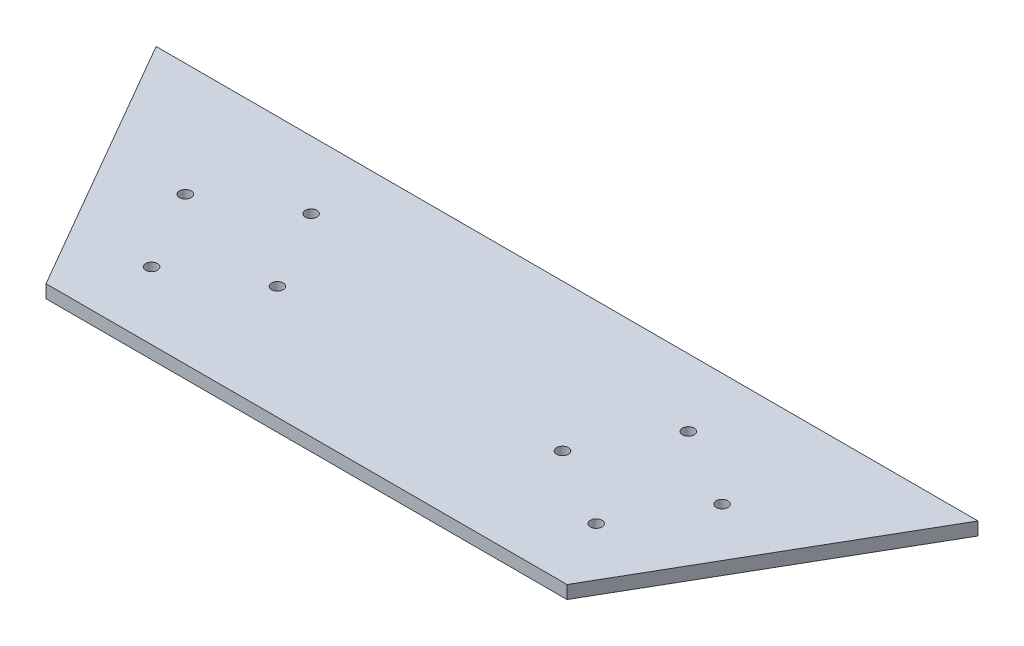
ISO-10303-21;
HEADER;
FILE_DESCRIPTION(('STEP AP214'),'2;1');
FILE_NAME('part.step','',(''),(''),'','','');
FILE_SCHEMA(('AUTOMOTIVE_DESIGN { 1 0 10303 214 1 1 1 1 }'));
ENDSEC;
DATA;
#1=APPLICATION_CONTEXT('core data for automotive mechanical design processes');
#2=APPLICATION_PROTOCOL_DEFINITION('international standard','automotive_design',2000,#1);
#3=PRODUCT_CONTEXT('',#1,'mechanical');
#4=PRODUCT('Part','Part','',(#3));
#5=PRODUCT_RELATED_PRODUCT_CATEGORY('part','',(#4));
#6=PRODUCT_DEFINITION_FORMATION('','',#4);
#7=PRODUCT_DEFINITION_CONTEXT('part definition',#1,'design');
#8=PRODUCT_DEFINITION('design','',#6,#7);
#9=PRODUCT_DEFINITION_SHAPE('','',#8);
#10=(LENGTH_UNIT() NAMED_UNIT(*) SI_UNIT(.MILLI.,.METRE.));
#11=(NAMED_UNIT(*) PLANE_ANGLE_UNIT() SI_UNIT($,.RADIAN.));
#12=(NAMED_UNIT(*) SI_UNIT($,.STERADIAN.) SOLID_ANGLE_UNIT());
#13=UNCERTAINTY_MEASURE_WITH_UNIT(LENGTH_MEASURE(1.E-05),#10,'distance_accuracy_value','');
#14=(GEOMETRIC_REPRESENTATION_CONTEXT(3) GLOBAL_UNCERTAINTY_ASSIGNED_CONTEXT((#13)) GLOBAL_UNIT_ASSIGNED_CONTEXT((#10,
#11,#12)) REPRESENTATION_CONTEXT('',''));
#15=CARTESIAN_POINT('',(0.,0.,0.));
#16=DIRECTION('',(0.,0.,1.));
#17=DIRECTION('',(1.,0.,0.));
#18=AXIS2_PLACEMENT_3D('',#15,#16,#17);
#19=CARTESIAN_POINT('',(200.,10.,0.));
#20=DIRECTION('',(-0.866025403784436,0.,-0.500000000000004));
#21=DIRECTION('',(-0.500000000000004,0.,0.866025403784436));
#22=AXIS2_PLACEMENT_3D('',#19,#20,#21);
#23=PLANE('',#22);
#24=DIRECTION('',(0.500000000000004,0.,-0.866025403784436));
#25=VECTOR('',#24,1.);
#26=CARTESIAN_POINT('',(200.,0.,0.));
#27=LINE('',#26,#25);
#28=CARTESIAN_POINT('',(200.,0.,0.));
#29=VERTEX_POINT('',#28);
#30=CARTESIAN_POINT('',(315.470053837926,0.,-200.));
#31=VERTEX_POINT('',#30);
#32=EDGE_CURVE('E96',#29,#31,#27,.T.);
#33=ORIENTED_EDGE('',*,*,#32,.T.);
#34=DIRECTION('',(0.,-1.,0.));
#35=VECTOR('',#34,1.);
#36=CARTESIAN_POINT('',(315.470053837926,10.,-200.));
#37=LINE('',#36,#35);
#38=CARTESIAN_POINT('',(315.470053837926,10.,-200.));
#39=VERTEX_POINT('',#38);
#40=EDGE_CURVE('E11',#39,#31,#37,.T.);
#41=ORIENTED_EDGE('',*,*,#40,.F.);
#42=DIRECTION('',(0.500000000000004,0.,-0.866025403784436));
#43=VECTOR('',#42,1.);
#44=CARTESIAN_POINT('',(200.,10.,0.));
#45=LINE('',#44,#43);
#46=CARTESIAN_POINT('',(200.,10.,0.));
#47=VERTEX_POINT('',#46);
#48=EDGE_CURVE('E84',#47,#39,#45,.T.);
#49=ORIENTED_EDGE('',*,*,#48,.F.);
#50=DIRECTION('',(0.,-1.,0.));
#51=VECTOR('',#50,1.);
#52=CARTESIAN_POINT('',(200.,10.,0.));
#53=LINE('',#52,#51);
#54=EDGE_CURVE('E92',#47,#29,#53,.T.);
#55=ORIENTED_EDGE('',*,*,#54,.T.);
#56=EDGE_LOOP('',(#33,#41,#49,#55));
#57=FACE_BOUND('',#56,.T.);
#58=ADVANCED_FACE('F33',(#57),#23,.F.);
#59=CARTESIAN_POINT('',(315.470053837926,10.,-200.));
#60=DIRECTION('',(0.,0.,1.));
#61=DIRECTION('',(1.,0.,0.));
#62=AXIS2_PLACEMENT_3D('',#59,#60,#61);
#63=PLANE('',#62);
#64=DIRECTION('',(-1.,0.,0.));
#65=VECTOR('',#64,1.);
#66=CARTESIAN_POINT('',(315.470053837926,0.,-200.));
#67=LINE('',#66,#65);
#68=CARTESIAN_POINT('',(-315.470053837926,0.,-200.));
#69=VERTEX_POINT('',#68);
#70=EDGE_CURVE('E88',#31,#69,#67,.T.);
#71=ORIENTED_EDGE('',*,*,#70,.T.);
#72=DIRECTION('',(0.,-1.,0.));
#73=VECTOR('',#72,1.);
#74=CARTESIAN_POINT('',(-315.470053837926,10.,-200.));
#75=LINE('',#74,#73);
#76=CARTESIAN_POINT('',(-315.470053837926,10.,-200.));
#77=VERTEX_POINT('',#76);
#78=EDGE_CURVE('E41',#77,#69,#75,.T.);
#79=ORIENTED_EDGE('',*,*,#78,.F.);
#80=DIRECTION('',(-1.,0.,0.));
#81=VECTOR('',#80,1.);
#82=CARTESIAN_POINT('',(315.470053837926,10.,-200.));
#83=LINE('',#82,#81);
#84=EDGE_CURVE('E79',#39,#77,#83,.T.);
#85=ORIENTED_EDGE('',*,*,#84,.F.);
#86=ORIENTED_EDGE('',*,*,#40,.T.);
#87=EDGE_LOOP('',(#71,#79,#85,#86));
#88=FACE_BOUND('',#87,.T.);
#89=ADVANCED_FACE('F87',(#88),#63,.F.);
#90=CARTESIAN_POINT('',(-315.470053837926,10.,-200.));
#91=DIRECTION('',(0.866025403784436,0.,-0.500000000000004));
#92=DIRECTION('',(-0.500000000000004,0.,-0.866025403784436));
#93=AXIS2_PLACEMENT_3D('',#90,#91,#92);
#94=PLANE('',#93);
#95=DIRECTION('',(0.500000000000004,0.,0.866025403784436));
#96=VECTOR('',#95,1.);
#97=CARTESIAN_POINT('',(-315.470053837926,0.,-200.));
#98=LINE('',#97,#96);
#99=CARTESIAN_POINT('',(-200.,0.,0.));
#100=VERTEX_POINT('',#99);
#101=EDGE_CURVE('E66',#69,#100,#98,.T.);
#102=ORIENTED_EDGE('',*,*,#101,.T.);
#103=DIRECTION('',(0.,-1.,0.));
#104=VECTOR('',#103,1.);
#105=CARTESIAN_POINT('',(-200.,10.,0.));
#106=LINE('',#105,#104);
#107=CARTESIAN_POINT('',(-200.,10.,0.));
#108=VERTEX_POINT('',#107);
#109=EDGE_CURVE('E89',#108,#100,#106,.T.);
#110=ORIENTED_EDGE('',*,*,#109,.F.);
#111=DIRECTION('',(0.500000000000004,0.,0.866025403784436));
#112=VECTOR('',#111,1.);
#113=CARTESIAN_POINT('',(-315.470053837926,10.,-200.));
#114=LINE('',#113,#112);
#115=EDGE_CURVE('E82',#77,#108,#114,.T.);
#116=ORIENTED_EDGE('',*,*,#115,.F.);
#117=ORIENTED_EDGE('',*,*,#78,.T.);
#118=EDGE_LOOP('',(#102,#110,#116,#117));
#119=FACE_BOUND('',#118,.T.);
#120=ADVANCED_FACE('F90',(#119),#94,.F.);
#121=CARTESIAN_POINT('',(-200.,10.,0.));
#122=DIRECTION('',(0.,0.,-1.));
#123=DIRECTION('',(-1.,0.,0.));
#124=AXIS2_PLACEMENT_3D('',#121,#122,#123);
#125=PLANE('',#124);
#126=DIRECTION('',(1.,0.,0.));
#127=VECTOR('',#126,1.);
#128=CARTESIAN_POINT('',(-200.,0.,0.));
#129=LINE('',#128,#127);
#130=EDGE_CURVE('E72',#100,#29,#129,.T.);
#131=ORIENTED_EDGE('',*,*,#130,.T.);
#132=ORIENTED_EDGE('',*,*,#54,.F.);
#133=DIRECTION('',(1.,0.,0.));
#134=VECTOR('',#133,1.);
#135=CARTESIAN_POINT('',(-200.,10.,0.));
#136=LINE('',#135,#134);
#137=EDGE_CURVE('E49',#108,#47,#136,.T.);
#138=ORIENTED_EDGE('',*,*,#137,.F.);
#139=ORIENTED_EDGE('',*,*,#109,.T.);
#140=EDGE_LOOP('',(#131,#132,#138,#139));
#141=FACE_BOUND('',#140,.T.);
#142=ADVANCED_FACE('F104',(#141),#125,.F.);
#143=CARTESIAN_POINT('',(0.,10.,0.));
#144=DIRECTION('',(0.,1.,0.));
#145=DIRECTION('',(0.,0.,1.));
#146=AXIS2_PLACEMENT_3D('',#143,#144,#145);
#147=PLANE('',#146);
#148=CARTESIAN_POINT('',(-206.031318233417,10.,-112.940952255125));
#149=DIRECTION('',(0.,1.,0.));
#150=DIRECTION('',(0.,0.,1.));
#151=AXIS2_PLACEMENT_3D('',#148,#149,#150);
#152=CIRCLE('',#151,4.49999999999998);
#153=CARTESIAN_POINT('',(-206.031318233417,10.,-108.440952255125));
#154=VERTEX_POINT('',#153);
#155=EDGE_CURVE('E154',#154,#154,#152,.T.);
#156=ORIENTED_EDGE('',*,*,#155,.F.);
#157=EDGE_LOOP('',(#156));
#158=FACE_BOUND('',#157,.T.);
#159=CARTESIAN_POINT('',(-144.794074663837,10.,-148.296291314453));
#160=DIRECTION('',(0.,1.,0.));
#161=DIRECTION('',(0.,0.,1.));
#162=AXIS2_PLACEMENT_3D('',#159,#160,#161);
#163=CIRCLE('',#162,4.49999999999998);
#164=CARTESIAN_POINT('',(-144.794074663837,10.,-143.796291314453));
#165=VERTEX_POINT('',#164);
#166=EDGE_CURVE('E148',#165,#165,#163,.T.);
#167=ORIENTED_EDGE('',*,*,#166,.F.);
#168=EDGE_LOOP('',(#167));
#169=FACE_BOUND('',#168,.T.);
#170=CARTESIAN_POINT('',(-109.43873560451,10.,-87.0590477448744));
#171=DIRECTION('',(0.,1.,0.));
#172=DIRECTION('',(0.,0.,1.));
#173=AXIS2_PLACEMENT_3D('',#170,#171,#172);
#174=CIRCLE('',#173,4.49999999999999);
#175=CARTESIAN_POINT('',(-109.43873560451,10.,-82.5590477448744));
#176=VERTEX_POINT('',#175);
#177=EDGE_CURVE('E142',#176,#176,#174,.T.);
#178=ORIENTED_EDGE('',*,*,#177,.F.);
#179=EDGE_LOOP('',(#178));
#180=FACE_BOUND('',#179,.T.);
#181=CARTESIAN_POINT('',(109.43873560451,10.,-87.0590477448737));
#182=DIRECTION('',(0.,1.,0.));
#183=DIRECTION('',(0.,0.,1.));
#184=AXIS2_PLACEMENT_3D('',#181,#182,#183);
#185=CIRCLE('',#184,4.49999999999999);
#186=CARTESIAN_POINT('',(109.43873560451,10.,-82.5590477448737));
#187=VERTEX_POINT('',#186);
#188=EDGE_CURVE('E136',#187,#187,#185,.T.);
#189=ORIENTED_EDGE('',*,*,#188,.F.);
#190=EDGE_LOOP('',(#189));
#191=FACE_BOUND('',#190,.T.);
#192=CARTESIAN_POINT('',(144.794074663837,10.,-148.296291314454));
#193=DIRECTION('',(0.,1.,0.));
#194=DIRECTION('',(0.,0.,1.));
#195=AXIS2_PLACEMENT_3D('',#192,#193,#194);
#196=CIRCLE('',#195,4.49999999999998);
#197=CARTESIAN_POINT('',(144.794074663837,10.,-143.796291314454));
#198=VERTEX_POINT('',#197);
#199=EDGE_CURVE('E130',#198,#198,#196,.T.);
#200=ORIENTED_EDGE('',*,*,#199,.F.);
#201=EDGE_LOOP('',(#200));
#202=FACE_BOUND('',#201,.T.);
#203=CARTESIAN_POINT('',(206.031318233417,10.,-112.940952255126));
#204=DIRECTION('',(0.,1.,0.));
#205=DIRECTION('',(0.,0.,1.));
#206=AXIS2_PLACEMENT_3D('',#203,#204,#205);
#207=CIRCLE('',#206,4.49999999999998);
#208=CARTESIAN_POINT('',(206.031318233417,10.,-108.440952255126));
#209=VERTEX_POINT('',#208);
#210=EDGE_CURVE('E124',#209,#209,#207,.T.);
#211=ORIENTED_EDGE('',*,*,#210,.F.);
#212=EDGE_LOOP('',(#211));
#213=FACE_BOUND('',#212,.T.);
#214=CARTESIAN_POINT('',(170.675979174089,10.,-51.7037086855466));
#215=DIRECTION('',(0.,1.,0.));
#216=DIRECTION('',(0.,0.,1.));
#217=AXIS2_PLACEMENT_3D('',#214,#215,#216);
#218=CIRCLE('',#217,4.49999999999998);
#219=CARTESIAN_POINT('',(170.675979174089,10.,-47.2037086855466));
#220=VERTEX_POINT('',#219);
#221=EDGE_CURVE('E118',#220,#220,#218,.T.);
#222=ORIENTED_EDGE('',*,*,#221,.F.);
#223=EDGE_LOOP('',(#222));
#224=FACE_BOUND('',#223,.T.);
#225=CARTESIAN_POINT('',(-170.675979174089,10.,-51.7037086855464));
#226=DIRECTION('',(0.,1.,0.));
#227=DIRECTION('',(0.,0.,1.));
#228=AXIS2_PLACEMENT_3D('',#225,#226,#227);
#229=CIRCLE('',#228,4.49999999999998);
#230=CARTESIAN_POINT('',(-170.675979174089,10.,-47.2037086855465));
#231=VERTEX_POINT('',#230);
#232=EDGE_CURVE('E112',#231,#231,#229,.T.);
#233=ORIENTED_EDGE('',*,*,#232,.F.);
#234=EDGE_LOOP('',(#233));
#235=FACE_BOUND('',#234,.T.);
#236=ORIENTED_EDGE('',*,*,#48,.T.);
#237=ORIENTED_EDGE('',*,*,#84,.T.);
#238=ORIENTED_EDGE('',*,*,#115,.T.);
#239=ORIENTED_EDGE('',*,*,#137,.T.);
#240=EDGE_LOOP('',(#236,#237,#238,#239));
#241=FACE_BOUND('',#240,.T.);
#242=ADVANCED_FACE('F80',(#158,#169,#180,#191,#202,#213,#224,#235,#241),#147,.T.);
#243=CARTESIAN_POINT('',(0.,0.,0.));
#244=DIRECTION('',(0.,1.,0.));
#245=DIRECTION('',(0.,0.,1.));
#246=AXIS2_PLACEMENT_3D('',#243,#244,#245);
#247=PLANE('',#246);
#248=CARTESIAN_POINT('',(-206.031318233417,0.,-112.940952255125));
#249=DIRECTION('',(0.,1.,0.));
#250=DIRECTION('',(0.,0.,1.));
#251=AXIS2_PLACEMENT_3D('',#248,#249,#250);
#252=CIRCLE('',#251,4.5);
#253=CARTESIAN_POINT('',(-206.031318233417,0.,-108.440952255125));
#254=VERTEX_POINT('',#253);
#255=EDGE_CURVE('E151',#254,#254,#252,.T.);
#256=ORIENTED_EDGE('',*,*,#255,.T.);
#257=EDGE_LOOP('',(#256));
#258=FACE_BOUND('',#257,.T.);
#259=CARTESIAN_POINT('',(-144.794074663837,0.,-148.296291314453));
#260=DIRECTION('',(0.,1.,0.));
#261=DIRECTION('',(0.,0.,1.));
#262=AXIS2_PLACEMENT_3D('',#259,#260,#261);
#263=CIRCLE('',#262,4.5);
#264=CARTESIAN_POINT('',(-144.794074663837,0.,-143.796291314453));
#265=VERTEX_POINT('',#264);
#266=EDGE_CURVE('E145',#265,#265,#263,.T.);
#267=ORIENTED_EDGE('',*,*,#266,.T.);
#268=EDGE_LOOP('',(#267));
#269=FACE_BOUND('',#268,.T.);
#270=CARTESIAN_POINT('',(-109.43873560451,0.,-87.0590477448744));
#271=DIRECTION('',(0.,1.,0.));
#272=DIRECTION('',(0.,0.,1.));
#273=AXIS2_PLACEMENT_3D('',#270,#271,#272);
#274=CIRCLE('',#273,4.5);
#275=CARTESIAN_POINT('',(-109.43873560451,0.,-82.5590477448743));
#276=VERTEX_POINT('',#275);
#277=EDGE_CURVE('E139',#276,#276,#274,.T.);
#278=ORIENTED_EDGE('',*,*,#277,.T.);
#279=EDGE_LOOP('',(#278));
#280=FACE_BOUND('',#279,.T.);
#281=CARTESIAN_POINT('',(109.43873560451,0.,-87.0590477448737));
#282=DIRECTION('',(0.,1.,0.));
#283=DIRECTION('',(0.,0.,1.));
#284=AXIS2_PLACEMENT_3D('',#281,#282,#283);
#285=CIRCLE('',#284,4.5);
#286=CARTESIAN_POINT('',(109.43873560451,0.,-82.5590477448737));
#287=VERTEX_POINT('',#286);
#288=EDGE_CURVE('E133',#287,#287,#285,.T.);
#289=ORIENTED_EDGE('',*,*,#288,.T.);
#290=EDGE_LOOP('',(#289));
#291=FACE_BOUND('',#290,.T.);
#292=CARTESIAN_POINT('',(144.794074663837,0.,-148.296291314454));
#293=DIRECTION('',(0.,1.,0.));
#294=DIRECTION('',(0.,0.,1.));
#295=AXIS2_PLACEMENT_3D('',#292,#293,#294);
#296=CIRCLE('',#295,4.5);
#297=CARTESIAN_POINT('',(144.794074663837,0.,-143.796291314453));
#298=VERTEX_POINT('',#297);
#299=EDGE_CURVE('E127',#298,#298,#296,.T.);
#300=ORIENTED_EDGE('',*,*,#299,.T.);
#301=EDGE_LOOP('',(#300));
#302=FACE_BOUND('',#301,.T.);
#303=CARTESIAN_POINT('',(206.031318233417,0.,-112.940952255126));
#304=DIRECTION('',(0.,1.,0.));
#305=DIRECTION('',(0.,0.,1.));
#306=AXIS2_PLACEMENT_3D('',#303,#304,#305);
#307=CIRCLE('',#306,4.5);
#308=CARTESIAN_POINT('',(206.031318233417,0.,-108.440952255126));
#309=VERTEX_POINT('',#308);
#310=EDGE_CURVE('E121',#309,#309,#307,.T.);
#311=ORIENTED_EDGE('',*,*,#310,.T.);
#312=EDGE_LOOP('',(#311));
#313=FACE_BOUND('',#312,.T.);
#314=CARTESIAN_POINT('',(170.675979174089,0.,-51.7037086855466));
#315=DIRECTION('',(0.,1.,0.));
#316=DIRECTION('',(0.,0.,1.));
#317=AXIS2_PLACEMENT_3D('',#314,#315,#316);
#318=CIRCLE('',#317,4.5);
#319=CARTESIAN_POINT('',(170.675979174089,0.,-47.2037086855465));
#320=VERTEX_POINT('',#319);
#321=EDGE_CURVE('E115',#320,#320,#318,.T.);
#322=ORIENTED_EDGE('',*,*,#321,.T.);
#323=EDGE_LOOP('',(#322));
#324=FACE_BOUND('',#323,.T.);
#325=CARTESIAN_POINT('',(-170.675979174089,0.,-51.7037086855464));
#326=DIRECTION('',(0.,1.,0.));
#327=DIRECTION('',(0.,0.,1.));
#328=AXIS2_PLACEMENT_3D('',#325,#326,#327);
#329=CIRCLE('',#328,4.5);
#330=CARTESIAN_POINT('',(-170.675979174089,0.,-47.2037086855464));
#331=VERTEX_POINT('',#330);
#332=EDGE_CURVE('E99',#331,#331,#329,.T.);
#333=ORIENTED_EDGE('',*,*,#332,.T.);
#334=EDGE_LOOP('',(#333));
#335=FACE_BOUND('',#334,.T.);
#336=ORIENTED_EDGE('',*,*,#32,.F.);
#337=ORIENTED_EDGE('',*,*,#130,.F.);
#338=ORIENTED_EDGE('',*,*,#101,.F.);
#339=ORIENTED_EDGE('',*,*,#70,.F.);
#340=EDGE_LOOP('',(#336,#337,#338,#339));
#341=FACE_BOUND('',#340,.T.);
#342=ADVANCED_FACE('F107',(#258,#269,#280,#291,#302,#313,#324,#335,#341),#247,.F.);
#343=CARTESIAN_POINT('',(-170.675979174089,10.,-51.7037086855464));
#344=DIRECTION('',(0.,1.,0.));
#345=DIRECTION('',(0.,0.,1.));
#346=AXIS2_PLACEMENT_3D('',#343,#344,#345);
#347=CYLINDRICAL_SURFACE('',#346,4.49999999999999);
#348=ORIENTED_EDGE('',*,*,#332,.F.);
#349=EDGE_LOOP('',(#348));
#350=FACE_BOUND('',#349,.T.);
#351=ORIENTED_EDGE('',*,*,#232,.T.);
#352=EDGE_LOOP('',(#351));
#353=FACE_BOUND('',#352,.T.);
#354=ADVANCED_FACE('F177',(#350,#353),#347,.F.);
#355=CARTESIAN_POINT('',(170.675979174089,10.,-51.7037086855466));
#356=DIRECTION('',(0.,1.,0.));
#357=DIRECTION('',(0.,0.,1.));
#358=AXIS2_PLACEMENT_3D('',#355,#356,#357);
#359=CYLINDRICAL_SURFACE('',#358,4.49999999999999);
#360=ORIENTED_EDGE('',*,*,#321,.F.);
#361=EDGE_LOOP('',(#360));
#362=FACE_BOUND('',#361,.T.);
#363=ORIENTED_EDGE('',*,*,#221,.T.);
#364=EDGE_LOOP('',(#363));
#365=FACE_BOUND('',#364,.T.);
#366=ADVANCED_FACE('F179',(#362,#365),#359,.F.);
#367=CARTESIAN_POINT('',(206.031318233417,10.,-112.940952255126));
#368=DIRECTION('',(0.,1.,0.));
#369=DIRECTION('',(0.,0.,1.));
#370=AXIS2_PLACEMENT_3D('',#367,#368,#369);
#371=CYLINDRICAL_SURFACE('',#370,4.49999999999999);
#372=ORIENTED_EDGE('',*,*,#310,.F.);
#373=EDGE_LOOP('',(#372));
#374=FACE_BOUND('',#373,.T.);
#375=ORIENTED_EDGE('',*,*,#210,.T.);
#376=EDGE_LOOP('',(#375));
#377=FACE_BOUND('',#376,.T.);
#378=ADVANCED_FACE('F186',(#374,#377),#371,.F.);
#379=CARTESIAN_POINT('',(144.794074663837,10.,-148.296291314454));
#380=DIRECTION('',(0.,1.,0.));
#381=DIRECTION('',(0.,0.,1.));
#382=AXIS2_PLACEMENT_3D('',#379,#380,#381);
#383=CYLINDRICAL_SURFACE('',#382,4.49999999999999);
#384=ORIENTED_EDGE('',*,*,#299,.F.);
#385=EDGE_LOOP('',(#384));
#386=FACE_BOUND('',#385,.T.);
#387=ORIENTED_EDGE('',*,*,#199,.T.);
#388=EDGE_LOOP('',(#387));
#389=FACE_BOUND('',#388,.T.);
#390=ADVANCED_FACE('F255',(#386,#389),#383,.F.);
#391=CARTESIAN_POINT('',(109.43873560451,10.,-87.0590477448737));
#392=DIRECTION('',(0.,1.,0.));
#393=DIRECTION('',(0.,0.,1.));
#394=AXIS2_PLACEMENT_3D('',#391,#392,#393);
#395=CYLINDRICAL_SURFACE('',#394,4.5);
#396=ORIENTED_EDGE('',*,*,#288,.F.);
#397=EDGE_LOOP('',(#396));
#398=FACE_BOUND('',#397,.T.);
#399=ORIENTED_EDGE('',*,*,#188,.T.);
#400=EDGE_LOOP('',(#399));
#401=FACE_BOUND('',#400,.T.);
#402=ADVANCED_FACE('F227',(#398,#401),#395,.F.);
#403=CARTESIAN_POINT('',(-109.43873560451,10.,-87.0590477448744));
#404=DIRECTION('',(0.,1.,0.));
#405=DIRECTION('',(0.,0.,1.));
#406=AXIS2_PLACEMENT_3D('',#403,#404,#405);
#407=CYLINDRICAL_SURFACE('',#406,4.5);
#408=ORIENTED_EDGE('',*,*,#277,.F.);
#409=EDGE_LOOP('',(#408));
#410=FACE_BOUND('',#409,.T.);
#411=ORIENTED_EDGE('',*,*,#177,.T.);
#412=EDGE_LOOP('',(#411));
#413=FACE_BOUND('',#412,.T.);
#414=ADVANCED_FACE('F221',(#410,#413),#407,.F.);
#415=CARTESIAN_POINT('',(-144.794074663837,10.,-148.296291314453));
#416=DIRECTION('',(0.,1.,0.));
#417=DIRECTION('',(0.,0.,1.));
#418=AXIS2_PLACEMENT_3D('',#415,#416,#417);
#419=CYLINDRICAL_SURFACE('',#418,4.49999999999999);
#420=ORIENTED_EDGE('',*,*,#266,.F.);
#421=EDGE_LOOP('',(#420));
#422=FACE_BOUND('',#421,.T.);
#423=ORIENTED_EDGE('',*,*,#166,.T.);
#424=EDGE_LOOP('',(#423));
#425=FACE_BOUND('',#424,.T.);
#426=ADVANCED_FACE('F226',(#422,#425),#419,.F.);
#427=CARTESIAN_POINT('',(-206.031318233417,10.,-112.940952255125));
#428=DIRECTION('',(0.,1.,0.));
#429=DIRECTION('',(0.,0.,1.));
#430=AXIS2_PLACEMENT_3D('',#427,#428,#429);
#431=CYLINDRICAL_SURFACE('',#430,4.49999999999999);
#432=ORIENTED_EDGE('',*,*,#255,.F.);
#433=EDGE_LOOP('',(#432));
#434=FACE_BOUND('',#433,.T.);
#435=ORIENTED_EDGE('',*,*,#155,.T.);
#436=EDGE_LOOP('',(#435));
#437=FACE_BOUND('',#436,.T.);
#438=ADVANCED_FACE('F158',(#434,#437),#431,.F.);
#439=CLOSED_SHELL('',(#58,#89,#120,#142,#242,#342,#354,#366,#378,#390,#402,#414,#426,#438));
#440=MANIFOLD_SOLID_BREP('B2',#439);
#441=ADVANCED_BREP_SHAPE_REPRESENTATION('',(#18,#440),#14);
#442=SHAPE_DEFINITION_REPRESENTATION(#9,#441);
ENDSEC;
END-ISO-10303-21;
